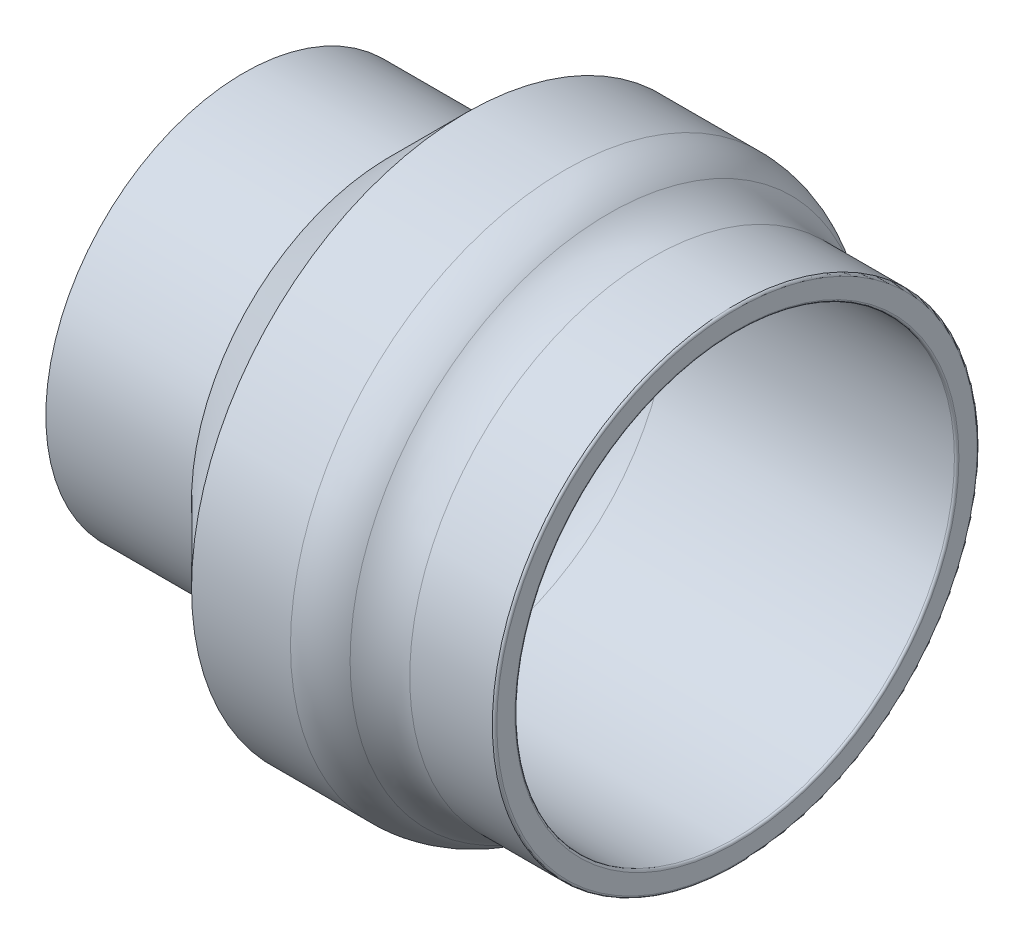
ISO-10303-21;
HEADER;
FILE_DESCRIPTION(('STEP AP214'),'2;1');
FILE_NAME('part.step','',(''),(''),'','','');
FILE_SCHEMA(('AUTOMOTIVE_DESIGN { 1 0 10303 214 1 1 1 1 }'));
ENDSEC;
DATA;
#1=APPLICATION_CONTEXT('core data for automotive mechanical design processes');
#2=APPLICATION_PROTOCOL_DEFINITION('international standard','automotive_design',2000,#1);
#3=PRODUCT_CONTEXT('',#1,'mechanical');
#4=PRODUCT('Part','Part','',(#3));
#5=PRODUCT_RELATED_PRODUCT_CATEGORY('part','',(#4));
#6=PRODUCT_DEFINITION_FORMATION('','',#4);
#7=PRODUCT_DEFINITION_CONTEXT('part definition',#1,'design');
#8=PRODUCT_DEFINITION('design','',#6,#7);
#9=PRODUCT_DEFINITION_SHAPE('','',#8);
#10=(LENGTH_UNIT() NAMED_UNIT(*) SI_UNIT(.MILLI.,.METRE.));
#11=(NAMED_UNIT(*) PLANE_ANGLE_UNIT() SI_UNIT($,.RADIAN.));
#12=(NAMED_UNIT(*) SI_UNIT($,.STERADIAN.) SOLID_ANGLE_UNIT());
#13=UNCERTAINTY_MEASURE_WITH_UNIT(LENGTH_MEASURE(1.E-05),#10,'distance_accuracy_value','');
#14=(GEOMETRIC_REPRESENTATION_CONTEXT(3) GLOBAL_UNCERTAINTY_ASSIGNED_CONTEXT((#13)) GLOBAL_UNIT_ASSIGNED_CONTEXT((#10,
#11,#12)) REPRESENTATION_CONTEXT('',''));
#15=CARTESIAN_POINT('',(0.,0.,0.));
#16=DIRECTION('',(0.,0.,1.));
#17=DIRECTION('',(1.,0.,0.));
#18=AXIS2_PLACEMENT_3D('',#15,#16,#17);
#19=CARTESIAN_POINT('',(22.,0.,0.));
#20=DIRECTION('',(1.,0.,0.));
#21=DIRECTION('',(0.,0.,-1.));
#22=AXIS2_PLACEMENT_3D('',#19,#20,#21);
#23=PLANE('',#22);
#24=CARTESIAN_POINT('',(22.,0.,0.));
#25=DIRECTION('',(1.,0.,0.));
#26=DIRECTION('',(0.,0.,-1.));
#27=AXIS2_PLACEMENT_3D('',#24,#25,#26);
#28=CIRCLE('',#27,9.9);
#29=CARTESIAN_POINT('',(22.,0.,-9.9));
#30=VERTEX_POINT('',#29);
#31=EDGE_CURVE('E46',#30,#30,#28,.F.);
#32=ORIENTED_EDGE('',*,*,#31,.T.);
#33=EDGE_LOOP('',(#32));
#34=FACE_BOUND('',#33,.T.);
#35=CARTESIAN_POINT('',(22.,0.,0.));
#36=DIRECTION('',(1.,0.,0.));
#37=DIRECTION('',(0.,0.,-1.));
#38=AXIS2_PLACEMENT_3D('',#35,#36,#37);
#39=CIRCLE('',#38,10.7101433686694);
#40=CARTESIAN_POINT('',(22.,0.,-10.7101433686694));
#41=VERTEX_POINT('',#40);
#42=EDGE_CURVE('E49',#41,#41,#39,.T.);
#43=ORIENTED_EDGE('',*,*,#42,.T.);
#44=EDGE_LOOP('',(#43));
#45=FACE_BOUND('',#44,.T.);
#46=ADVANCED_FACE('F39',(#34,#45),#23,.T.);
#47=CARTESIAN_POINT('',(22.,0.,0.));
#48=DIRECTION('',(-1.,0.,0.));
#49=DIRECTION('',(0.,0.,1.));
#50=AXIS2_PLACEMENT_3D('',#47,#48,#49);
#51=CYLINDRICAL_SURFACE('',#50,12.24);
#52=CARTESIAN_POINT('',(14.3275026815501,0.,0.));
#53=DIRECTION('',(1.,0.,0.));
#54=DIRECTION('',(0.,0.,-1.));
#55=AXIS2_PLACEMENT_3D('',#52,#53,#54);
#56=CIRCLE('',#55,12.24);
#57=CARTESIAN_POINT('',(14.3275026815501,0.,-12.24));
#58=VERTEX_POINT('',#57);
#59=EDGE_CURVE('E61',#58,#58,#56,.F.);
#60=ORIENTED_EDGE('',*,*,#59,.T.);
#61=EDGE_LOOP('',(#60));
#62=FACE_BOUND('',#61,.T.);
#63=CARTESIAN_POINT('',(9.91499999999994,0.,0.));
#64=DIRECTION('',(1.,0.,0.));
#65=DIRECTION('',(0.,0.,-1.));
#66=AXIS2_PLACEMENT_3D('',#63,#64,#65);
#67=CIRCLE('',#66,12.24);
#68=CARTESIAN_POINT('',(9.91499999999994,0.,-12.24));
#69=VERTEX_POINT('',#68);
#70=EDGE_CURVE('E76',#69,#69,#67,.T.);
#71=ORIENTED_EDGE('',*,*,#70,.T.);
#72=EDGE_LOOP('',(#71));
#73=FACE_BOUND('',#72,.T.);
#74=ADVANCED_FACE('F100',(#62,#73),#51,.T.);
#75=CARTESIAN_POINT('',(10.,0.,0.));
#76=DIRECTION('',(-1.,0.,0.));
#77=DIRECTION('',(0.,0.,1.));
#78=AXIS2_PLACEMENT_3D('',#75,#76,#77);
#79=CYLINDRICAL_SURFACE('',#78,7.825);
#80=CARTESIAN_POINT('',(4.75735931288065,0.,0.));
#81=DIRECTION('',(-1.,0.,0.));
#82=DIRECTION('',(0.,0.,1.));
#83=AXIS2_PLACEMENT_3D('',#80,#81,#82);
#84=CIRCLE('',#83,7.825);
#85=CARTESIAN_POINT('',(4.75735931288065,0.,7.825));
#86=VERTEX_POINT('',#85);
#87=EDGE_CURVE('E80',#86,#86,#84,.F.);
#88=ORIENTED_EDGE('',*,*,#87,.T.);
#89=EDGE_LOOP('',(#88));
#90=FACE_BOUND('',#89,.T.);
#91=CARTESIAN_POINT('',(0.,0.,0.));
#92=DIRECTION('',(1.,0.,0.));
#93=DIRECTION('',(0.,0.,-1.));
#94=AXIS2_PLACEMENT_3D('',#91,#92,#93);
#95=CIRCLE('',#94,7.825);
#96=CARTESIAN_POINT('',(0.,0.,-7.825));
#97=VERTEX_POINT('',#96);
#98=EDGE_CURVE('E90',#97,#97,#95,.T.);
#99=ORIENTED_EDGE('',*,*,#98,.F.);
#100=EDGE_LOOP('',(#99));
#101=FACE_BOUND('',#100,.T.);
#102=ADVANCED_FACE('F92',(#90,#101),#79,.F.);
#103=CARTESIAN_POINT('',(0.,0.,0.));
#104=DIRECTION('',(1.,0.,0.));
#105=DIRECTION('',(0.,0.,-1.));
#106=AXIS2_PLACEMENT_3D('',#103,#104,#105);
#107=PLANE('',#106);
#108=CARTESIAN_POINT('',(0.,0.,0.));
#109=DIRECTION('',(1.,0.,0.));
#110=DIRECTION('',(0.,0.,-1.));
#111=AXIS2_PLACEMENT_3D('',#108,#109,#110);
#112=CIRCLE('',#111,8.825);
#113=CARTESIAN_POINT('',(0.,0.,-8.825));
#114=VERTEX_POINT('',#113);
#115=EDGE_CURVE('E88',#114,#114,#112,.T.);
#116=ORIENTED_EDGE('',*,*,#115,.F.);
#117=EDGE_LOOP('',(#116));
#118=FACE_BOUND('',#117,.T.);
#119=ORIENTED_EDGE('',*,*,#98,.T.);
#120=EDGE_LOOP('',(#119));
#121=FACE_BOUND('',#120,.T.);
#122=ADVANCED_FACE('F91',(#118,#121),#107,.F.);
#123=CARTESIAN_POINT('',(10.,0.,0.));
#124=DIRECTION('',(-1.,0.,0.));
#125=DIRECTION('',(0.,0.,1.));
#126=AXIS2_PLACEMENT_3D('',#123,#124,#125);
#127=CYLINDRICAL_SURFACE('',#126,8.825);
#128=CARTESIAN_POINT('',(6.49999999999998,0.,0.));
#129=DIRECTION('',(1.,0.,0.));
#130=DIRECTION('',(0.,0.,-1.));
#131=AXIS2_PLACEMENT_3D('',#128,#129,#130);
#132=CIRCLE('',#131,8.825);
#133=CARTESIAN_POINT('',(6.49999999999998,0.,-8.825));
#134=VERTEX_POINT('',#133);
#135=EDGE_CURVE('E83',#134,#134,#132,.F.);
#136=ORIENTED_EDGE('',*,*,#135,.T.);
#137=EDGE_LOOP('',(#136));
#138=FACE_BOUND('',#137,.T.);
#139=ORIENTED_EDGE('',*,*,#115,.T.);
#140=EDGE_LOOP('',(#139));
#141=FACE_BOUND('',#140,.T.);
#142=ADVANCED_FACE('F104',(#138,#141),#127,.T.);
#143=CARTESIAN_POINT('',(10.,0.,0.));
#144=DIRECTION('',(1.,0.,0.));
#145=DIRECTION('',(0.,0.,-1.));
#146=AXIS2_PLACEMENT_3D('',#143,#144,#145);
#147=CONICAL_SURFACE('',#146,12.3250000000001,0.785398163397454);
#148=ORIENTED_EDGE('',*,*,#135,.F.);
#149=EDGE_LOOP('',(#148));
#150=FACE_BOUND('',#149,.T.);
#151=ORIENTED_EDGE('',*,*,#70,.F.);
#152=EDGE_LOOP('',(#151));
#153=FACE_BOUND('',#152,.T.);
#154=ADVANCED_FACE('F125',(#150,#153),#147,.T.);
#155=CARTESIAN_POINT('',(10.,0.,0.));
#156=DIRECTION('',(1.,0.,0.));
#157=DIRECTION('',(0.,0.,-1.));
#158=AXIS2_PLACEMENT_3D('',#155,#156,#157);
#159=CYLINDRICAL_SURFACE('',#158,9.8);
#160=CARTESIAN_POINT('',(21.9,0.,0.));
#161=DIRECTION('',(1.,0.,0.));
#162=DIRECTION('',(0.,0.,-1.));
#163=AXIS2_PLACEMENT_3D('',#160,#161,#162);
#164=CIRCLE('',#163,9.8);
#165=CARTESIAN_POINT('',(21.9,0.,-9.8));
#166=VERTEX_POINT('',#165);
#167=EDGE_CURVE('E53',#166,#166,#164,.T.);
#168=ORIENTED_EDGE('',*,*,#167,.T.);
#169=EDGE_LOOP('',(#168));
#170=FACE_BOUND('',#169,.T.);
#171=CARTESIAN_POINT('',(9.21764068711923,0.,0.));
#172=DIRECTION('',(-1.,0.,0.));
#173=DIRECTION('',(0.,0.,1.));
#174=AXIS2_PLACEMENT_3D('',#171,#172,#173);
#175=CIRCLE('',#174,9.8);
#176=CARTESIAN_POINT('',(9.21764068711923,0.,9.8));
#177=VERTEX_POINT('',#176);
#178=EDGE_CURVE('E69',#177,#177,#175,.T.);
#179=ORIENTED_EDGE('',*,*,#178,.T.);
#180=EDGE_LOOP('',(#179));
#181=FACE_BOUND('',#180,.T.);
#182=ADVANCED_FACE('F119',(#170,#181),#159,.F.);
#183=CARTESIAN_POINT('',(5.99999999999993,0.,0.));
#184=DIRECTION('',(1.,0.,0.));
#185=DIRECTION('',(0.,0.,-1.));
#186=AXIS2_PLACEMENT_3D('',#183,#184,#185);
#187=CONICAL_SURFACE('',#186,7.825,0.785398163397443);
#188=CARTESIAN_POINT('',(6.87867965644028,0.,0.));
#189=DIRECTION('',(-1.,0.,0.));
#190=DIRECTION('',(0.,0.,1.));
#191=AXIS2_PLACEMENT_3D('',#188,#189,#190);
#192=CIRCLE('',#191,8.70367965644034);
#193=CARTESIAN_POINT('',(6.87867965644028,0.,8.70367965644034));
#194=VERTEX_POINT('',#193);
#195=EDGE_CURVE('E72',#194,#194,#192,.T.);
#196=ORIENTED_EDGE('',*,*,#195,.T.);
#197=EDGE_LOOP('',(#196));
#198=FACE_BOUND('',#197,.T.);
#199=CARTESIAN_POINT('',(7.0963203435596,0.,0.));
#200=DIRECTION('',(-1.,0.,0.));
#201=DIRECTION('',(0.,0.,1.));
#202=AXIS2_PLACEMENT_3D('',#199,#200,#201);
#203=CIRCLE('',#202,8.92132034355966);
#204=CARTESIAN_POINT('',(7.0963203435596,0.,8.92132034355966));
#205=VERTEX_POINT('',#204);
#206=EDGE_CURVE('E74',#205,#205,#203,.F.);
#207=ORIENTED_EDGE('',*,*,#206,.T.);
#208=EDGE_LOOP('',(#207));
#209=FACE_BOUND('',#208,.T.);
#210=ADVANCED_FACE('F122',(#198,#209),#187,.F.);
#211=CARTESIAN_POINT('',(4.75735931288065,0.,0.));
#212=DIRECTION('',(-1.,0.,0.));
#213=DIRECTION('',(0.,0.,1.));
#214=AXIS2_PLACEMENT_3D('',#211,#212,#213);
#215=TOROIDAL_SURFACE('',#214,10.825,3.);
#216=ORIENTED_EDGE('',*,*,#195,.F.);
#217=EDGE_LOOP('',(#216));
#218=FACE_BOUND('',#217,.T.);
#219=ORIENTED_EDGE('',*,*,#87,.F.);
#220=EDGE_LOOP('',(#219));
#221=FACE_BOUND('',#220,.T.);
#222=ADVANCED_FACE('F136',(#218,#221),#215,.T.);
#223=CARTESIAN_POINT('',(9.21764068711923,0.,0.));
#224=DIRECTION('',(-1.,0.,0.));
#225=DIRECTION('',(0.,0.,1.));
#226=AXIS2_PLACEMENT_3D('',#223,#224,#225);
#227=TOROIDAL_SURFACE('',#226,6.8,3.);
#228=ORIENTED_EDGE('',*,*,#206,.F.);
#229=EDGE_LOOP('',(#228));
#230=FACE_BOUND('',#229,.T.);
#231=ORIENTED_EDGE('',*,*,#178,.F.);
#232=EDGE_LOOP('',(#231));
#233=FACE_BOUND('',#232,.T.);
#234=ADVANCED_FACE('F130',(#230,#233),#227,.F.);
#235=CARTESIAN_POINT('',(15.,0.,0.));
#236=DIRECTION('',(1.,0.,0.));
#237=DIRECTION('',(0.,0.,-1.));
#238=AXIS2_PLACEMENT_3D('',#235,#236,#237);
#239=CYLINDRICAL_SURFACE('',#238,10.8101433686694);
#240=CARTESIAN_POINT('',(21.9,0.,0.));
#241=DIRECTION('',(1.,0.,0.));
#242=DIRECTION('',(0.,0.,-1.));
#243=AXIS2_PLACEMENT_3D('',#240,#241,#242);
#244=CIRCLE('',#243,10.8101433686694);
#245=CARTESIAN_POINT('',(21.9,0.,-10.8101433686694));
#246=VERTEX_POINT('',#245);
#247=EDGE_CURVE('E10',#246,#246,#244,.F.);
#248=ORIENTED_EDGE('',*,*,#247,.T.);
#249=EDGE_LOOP('',(#248));
#250=FACE_BOUND('',#249,.T.);
#251=CARTESIAN_POINT('',(18.2151484459952,0.,0.));
#252=DIRECTION('',(1.,0.,0.));
#253=DIRECTION('',(0.,0.,-1.));
#254=AXIS2_PLACEMENT_3D('',#251,#252,#253);
#255=CIRCLE('',#254,10.8101433686694);
#256=CARTESIAN_POINT('',(18.2151484459952,0.,-10.8101433686694));
#257=VERTEX_POINT('',#256);
#258=EDGE_CURVE('E65',#257,#257,#255,.T.);
#259=ORIENTED_EDGE('',*,*,#258,.T.);
#260=EDGE_LOOP('',(#259));
#261=FACE_BOUND('',#260,.T.);
#262=ADVANCED_FACE('F121',(#250,#261),#239,.T.);
#263=CARTESIAN_POINT('',(14.3275026815501,0.,0.));
#264=DIRECTION('',(1.,0.,0.));
#265=DIRECTION('',(0.,0.,-1.));
#266=AXIS2_PLACEMENT_3D('',#263,#264,#265);
#267=TOROIDAL_SURFACE('',#266,9.24,3.);
#268=CARTESIAN_POINT('',(16.2713255637726,0.,0.));
#269=DIRECTION('',(-1.,0.,0.));
#270=DIRECTION('',(0.,0.,1.));
#271=AXIS2_PLACEMENT_3D('',#268,#269,#270);
#272=CIRCLE('',#271,11.5250716843347);
#273=CARTESIAN_POINT('',(16.2713255637726,0.,11.5250716843347));
#274=VERTEX_POINT('',#273);
#275=EDGE_CURVE('E56',#274,#274,#272,.T.);
#276=ORIENTED_EDGE('',*,*,#275,.T.);
#277=EDGE_LOOP('',(#276));
#278=FACE_BOUND('',#277,.T.);
#279=ORIENTED_EDGE('',*,*,#59,.F.);
#280=EDGE_LOOP('',(#279));
#281=FACE_BOUND('',#280,.T.);
#282=ADVANCED_FACE('F127',(#278,#281),#267,.T.);
#283=CARTESIAN_POINT('',(18.2151484459952,0.,0.));
#284=DIRECTION('',(1.,0.,0.));
#285=DIRECTION('',(0.,0.,-1.));
#286=AXIS2_PLACEMENT_3D('',#283,#284,#285);
#287=TOROIDAL_SURFACE('',#286,13.8101433686694,3.);
#288=ORIENTED_EDGE('',*,*,#275,.F.);
#289=EDGE_LOOP('',(#288));
#290=FACE_BOUND('',#289,.T.);
#291=ORIENTED_EDGE('',*,*,#258,.F.);
#292=EDGE_LOOP('',(#291));
#293=FACE_BOUND('',#292,.T.);
#294=ADVANCED_FACE('F135',(#290,#293),#287,.F.);
#295=CARTESIAN_POINT('',(21.9,0.,0.));
#296=DIRECTION('',(1.,0.,0.));
#297=DIRECTION('',(0.,0.,-1.));
#298=AXIS2_PLACEMENT_3D('',#295,#296,#297);
#299=TOROIDAL_SURFACE('',#298,9.9,0.1);
#300=ORIENTED_EDGE('',*,*,#31,.F.);
#301=EDGE_LOOP('',(#300));
#302=FACE_BOUND('',#301,.T.);
#303=ORIENTED_EDGE('',*,*,#167,.F.);
#304=EDGE_LOOP('',(#303));
#305=FACE_BOUND('',#304,.T.);
#306=ADVANCED_FACE('F142',(#302,#305),#299,.T.);
#307=CARTESIAN_POINT('',(21.9,0.,0.));
#308=DIRECTION('',(1.,0.,0.));
#309=DIRECTION('',(0.,0.,-1.));
#310=AXIS2_PLACEMENT_3D('',#307,#308,#309);
#311=TOROIDAL_SURFACE('',#310,10.7101433686694,0.1);
#312=ORIENTED_EDGE('',*,*,#247,.F.);
#313=EDGE_LOOP('',(#312));
#314=FACE_BOUND('',#313,.T.);
#315=ORIENTED_EDGE('',*,*,#42,.F.);
#316=EDGE_LOOP('',(#315));
#317=FACE_BOUND('',#316,.T.);
#318=ADVANCED_FACE('F41',(#314,#317),#311,.T.);
#319=CLOSED_SHELL('',(#46,#74,#102,#122,#142,#154,#182,#210,#222,#234,#262,#282,#294,#306,#318));
#320=MANIFOLD_SOLID_BREP('B2',#319);
#321=ADVANCED_BREP_SHAPE_REPRESENTATION('',(#18,#320),#14);
#322=SHAPE_DEFINITION_REPRESENTATION(#9,#321);
ENDSEC;
END-ISO-10303-21;
